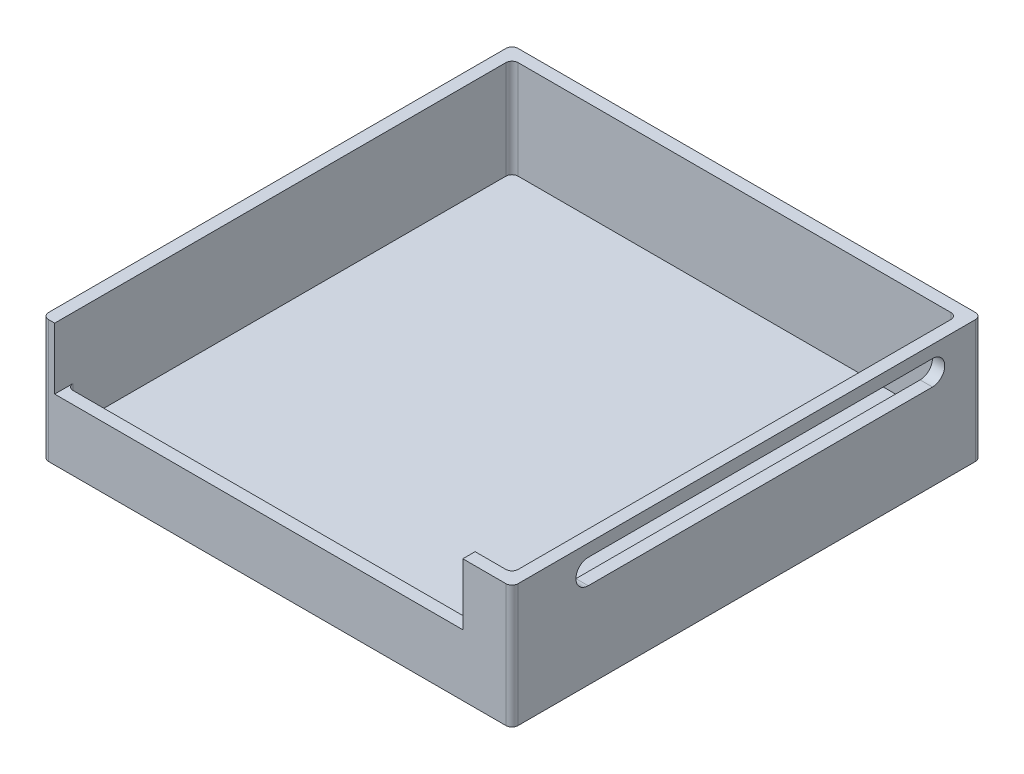
ISO-10303-21;
HEADER;
FILE_DESCRIPTION(('STEP AP214'),'2;1');
FILE_NAME('part.step','',(''),(''),'','','');
FILE_SCHEMA(('AUTOMOTIVE_DESIGN { 1 0 10303 214 1 1 1 1 }'));
ENDSEC;
DATA;
#1=APPLICATION_CONTEXT('core data for automotive mechanical design processes');
#2=APPLICATION_PROTOCOL_DEFINITION('international standard','automotive_design',2000,#1);
#3=PRODUCT_CONTEXT('',#1,'mechanical');
#4=PRODUCT('Part','Part','',(#3));
#5=PRODUCT_RELATED_PRODUCT_CATEGORY('part','',(#4));
#6=PRODUCT_DEFINITION_FORMATION('','',#4);
#7=PRODUCT_DEFINITION_CONTEXT('part definition',#1,'design');
#8=PRODUCT_DEFINITION('design','',#6,#7);
#9=PRODUCT_DEFINITION_SHAPE('','',#8);
#10=(LENGTH_UNIT() NAMED_UNIT(*) SI_UNIT(.MILLI.,.METRE.));
#11=(NAMED_UNIT(*) PLANE_ANGLE_UNIT() SI_UNIT($,.RADIAN.));
#12=(NAMED_UNIT(*) SI_UNIT($,.STERADIAN.) SOLID_ANGLE_UNIT());
#13=UNCERTAINTY_MEASURE_WITH_UNIT(LENGTH_MEASURE(1.E-05),#10,'distance_accuracy_value','');
#14=(GEOMETRIC_REPRESENTATION_CONTEXT(3) GLOBAL_UNCERTAINTY_ASSIGNED_CONTEXT((#13)) GLOBAL_UNIT_ASSIGNED_CONTEXT((#10,
#11,#12)) REPRESENTATION_CONTEXT('',''));
#15=CARTESIAN_POINT('',(0.,0.,0.));
#16=DIRECTION('',(0.,0.,1.));
#17=DIRECTION('',(1.,0.,0.));
#18=AXIS2_PLACEMENT_3D('',#15,#16,#17);
#19=CARTESIAN_POINT('',(-93.,50.,-93.));
#20=DIRECTION('',(0.,-1.,0.));
#21=DIRECTION('',(0.,0.,-1.));
#22=AXIS2_PLACEMENT_3D('',#19,#20,#21);
#23=PLANE('',#22);
#24=DIRECTION('',(1.,0.,0.));
#25=VECTOR('',#24,1.);
#26=CARTESIAN_POINT('',(-93.,50.,95.5));
#27=LINE('',#26,#25);
#28=CARTESIAN_POINT('',(-93.,50.,95.5));
#29=VERTEX_POINT('',#28);
#30=CARTESIAN_POINT('',(-90.5,50.,95.5));
#31=VERTEX_POINT('',#30);
#32=EDGE_CURVE('E350',#29,#31,#27,.T.);
#33=ORIENTED_EDGE('',*,*,#32,.T.);
#34=DIRECTION('',(0.,0.,1.));
#35=VECTOR('',#34,1.);
#36=CARTESIAN_POINT('',(-90.5,50.,-88.));
#37=LINE('',#36,#35);
#38=CARTESIAN_POINT('',(-90.5,50.,-88.));
#39=VERTEX_POINT('',#38);
#40=EDGE_CURVE('E295',#39,#31,#37,.T.);
#41=ORIENTED_EDGE('',*,*,#40,.F.);
#42=CARTESIAN_POINT('',(-88.,50.,-88.));
#43=DIRECTION('',(0.,1.,0.));
#44=DIRECTION('',(0.,0.,1.));
#45=AXIS2_PLACEMENT_3D('',#42,#43,#44);
#46=CIRCLE('',#45,2.5);
#47=CARTESIAN_POINT('',(-88.,50.,-90.5));
#48=VERTEX_POINT('',#47);
#49=EDGE_CURVE('E292',#48,#39,#46,.T.);
#50=ORIENTED_EDGE('',*,*,#49,.F.);
#51=DIRECTION('',(-1.,0.,0.));
#52=VECTOR('',#51,1.);
#53=CARTESIAN_POINT('',(-88.,50.,-90.5));
#54=LINE('',#53,#52);
#55=CARTESIAN_POINT('',(88.,50.,-90.5));
#56=VERTEX_POINT('',#55);
#57=EDGE_CURVE('E289',#56,#48,#54,.T.);
#58=ORIENTED_EDGE('',*,*,#57,.F.);
#59=CARTESIAN_POINT('',(88.,50.,-88.));
#60=DIRECTION('',(0.,1.,0.));
#61=DIRECTION('',(0.,0.,1.));
#62=AXIS2_PLACEMENT_3D('',#59,#60,#61);
#63=CIRCLE('',#62,2.5);
#64=CARTESIAN_POINT('',(90.5,50.,-88.));
#65=VERTEX_POINT('',#64);
#66=EDGE_CURVE('E286',#65,#56,#63,.T.);
#67=ORIENTED_EDGE('',*,*,#66,.F.);
#68=DIRECTION('',(0.,0.,-1.));
#69=VECTOR('',#68,1.);
#70=CARTESIAN_POINT('',(90.5,50.,-88.));
#71=LINE('',#70,#69);
#72=CARTESIAN_POINT('',(90.5000000000001,50.,88.));
#73=VERTEX_POINT('',#72);
#74=EDGE_CURVE('E305',#73,#65,#71,.T.);
#75=ORIENTED_EDGE('',*,*,#74,.F.);
#76=CARTESIAN_POINT('',(88.0000000000001,50.,88.));
#77=DIRECTION('',(0.,1.,0.));
#78=DIRECTION('',(0.,0.,1.));
#79=AXIS2_PLACEMENT_3D('',#76,#77,#78);
#80=CIRCLE('',#79,2.5);
#81=CARTESIAN_POINT('',(88.,50.,90.5));
#82=VERTEX_POINT('',#81);
#83=EDGE_CURVE('E301',#82,#73,#80,.T.);
#84=ORIENTED_EDGE('',*,*,#83,.F.);
#85=DIRECTION('',(1.,0.,0.));
#86=VECTOR('',#85,1.);
#87=CARTESIAN_POINT('',(-88.,50.,90.5));
#88=LINE('',#87,#86);
#89=CARTESIAN_POINT('',(75.5,50.,90.5));
#90=VERTEX_POINT('',#89);
#91=EDGE_CURVE('E298',#90,#82,#88,.T.);
#92=ORIENTED_EDGE('',*,*,#91,.F.);
#93=DIRECTION('',(0.,0.,1.));
#94=VECTOR('',#93,1.);
#95=CARTESIAN_POINT('',(75.5,50.,85.5));
#96=LINE('',#95,#94);
#97=CARTESIAN_POINT('',(75.5,50.,95.5));
#98=VERTEX_POINT('',#97);
#99=EDGE_CURVE('E245',#90,#98,#96,.T.);
#100=ORIENTED_EDGE('',*,*,#99,.T.);
#101=CARTESIAN_POINT('',(93.,50.,95.5));
#102=VERTEX_POINT('',#101);
#103=EDGE_CURVE('E349',#98,#102,#27,.T.);
#104=ORIENTED_EDGE('',*,*,#103,.T.);
#105=CARTESIAN_POINT('',(93.,50.,93.));
#106=DIRECTION('',(0.,1.,0.));
#107=DIRECTION('',(0.,0.,1.));
#108=AXIS2_PLACEMENT_3D('',#105,#106,#107);
#109=CIRCLE('',#108,2.5);
#110=CARTESIAN_POINT('',(95.5,50.,93.));
#111=VERTEX_POINT('',#110);
#112=EDGE_CURVE('E354',#102,#111,#109,.T.);
#113=ORIENTED_EDGE('',*,*,#112,.T.);
#114=DIRECTION('',(0.,0.,-1.));
#115=VECTOR('',#114,1.);
#116=CARTESIAN_POINT('',(95.5,50.,-93.));
#117=LINE('',#116,#115);
#118=CARTESIAN_POINT('',(95.5,50.,-93.));
#119=VERTEX_POINT('',#118);
#120=EDGE_CURVE('E357',#111,#119,#117,.T.);
#121=ORIENTED_EDGE('',*,*,#120,.T.);
#122=CARTESIAN_POINT('',(93.,50.,-93.));
#123=DIRECTION('',(0.,1.,0.));
#124=DIRECTION('',(0.,0.,1.));
#125=AXIS2_PLACEMENT_3D('',#122,#123,#124);
#126=CIRCLE('',#125,2.5);
#127=CARTESIAN_POINT('',(93.,50.,-95.5));
#128=VERTEX_POINT('',#127);
#129=EDGE_CURVE('E360',#119,#128,#126,.T.);
#130=ORIENTED_EDGE('',*,*,#129,.T.);
#131=DIRECTION('',(-1.,0.,0.));
#132=VECTOR('',#131,1.);
#133=CARTESIAN_POINT('',(-93.,50.,-95.5));
#134=LINE('',#133,#132);
#135=CARTESIAN_POINT('',(-93.,50.,-95.5));
#136=VERTEX_POINT('',#135);
#137=EDGE_CURVE('E363',#128,#136,#134,.T.);
#138=ORIENTED_EDGE('',*,*,#137,.T.);
#139=CARTESIAN_POINT('',(-93.,50.,-93.));
#140=DIRECTION('',(0.,1.,0.));
#141=DIRECTION('',(0.,0.,-1.));
#142=AXIS2_PLACEMENT_3D('',#139,#140,#141);
#143=CIRCLE('',#142,2.5);
#144=CARTESIAN_POINT('',(-95.5,50.,-93.));
#145=VERTEX_POINT('',#144);
#146=EDGE_CURVE('E338',#136,#145,#143,.T.);
#147=ORIENTED_EDGE('',*,*,#146,.T.);
#148=DIRECTION('',(0.,0.,1.));
#149=VECTOR('',#148,1.);
#150=CARTESIAN_POINT('',(-95.5,50.,-93.));
#151=LINE('',#150,#149);
#152=CARTESIAN_POINT('',(-95.5,50.,93.));
#153=VERTEX_POINT('',#152);
#154=EDGE_CURVE('E342',#145,#153,#151,.T.);
#155=ORIENTED_EDGE('',*,*,#154,.T.);
#156=CARTESIAN_POINT('',(-93.,50.,93.));
#157=DIRECTION('',(0.,1.,0.));
#158=DIRECTION('',(0.,0.,-1.));
#159=AXIS2_PLACEMENT_3D('',#156,#157,#158);
#160=CIRCLE('',#159,2.5);
#161=EDGE_CURVE('E346',#153,#29,#160,.T.);
#162=ORIENTED_EDGE('',*,*,#161,.T.);
#163=EDGE_LOOP('',(#33,#41,#50,#58,#67,#75,#84,#92,#100,#104,#113,#121,#130,#138,#147,#155,#162));
#164=FACE_BOUND('',#163,.T.);
#165=ADVANCED_FACE('F39',(#164),#23,.F.);
#166=CARTESIAN_POINT('',(-93.,50.,95.5));
#167=DIRECTION('',(0.,0.,-1.));
#168=DIRECTION('',(-1.,0.,0.));
#169=AXIS2_PLACEMENT_3D('',#166,#167,#168);
#170=PLANE('',#169);
#171=DIRECTION('',(0.,1.,0.));
#172=VECTOR('',#171,1.);
#173=CARTESIAN_POINT('',(-90.5,0.,95.5));
#174=LINE('',#173,#172);
#175=CARTESIAN_POINT('',(-90.5,25.,95.5));
#176=VERTEX_POINT('',#175);
#177=EDGE_CURVE('E236',#176,#31,#174,.T.);
#178=ORIENTED_EDGE('',*,*,#177,.T.);
#179=ORIENTED_EDGE('',*,*,#32,.F.);
#180=DIRECTION('',(0.,-1.,0.));
#181=VECTOR('',#180,1.);
#182=CARTESIAN_POINT('',(-93.,50.,95.5));
#183=LINE('',#182,#181);
#184=CARTESIAN_POINT('',(-93.,0.,95.5));
#185=VERTEX_POINT('',#184);
#186=EDGE_CURVE('E409',#29,#185,#183,.T.);
#187=ORIENTED_EDGE('',*,*,#186,.T.);
#188=DIRECTION('',(1.,0.,0.));
#189=VECTOR('',#188,1.);
#190=CARTESIAN_POINT('',(-93.,0.,95.5));
#191=LINE('',#190,#189);
#192=CARTESIAN_POINT('',(93.,0.,95.5));
#193=VERTEX_POINT('',#192);
#194=EDGE_CURVE('E376',#185,#193,#191,.T.);
#195=ORIENTED_EDGE('',*,*,#194,.T.);
#196=DIRECTION('',(0.,-1.,0.));
#197=VECTOR('',#196,1.);
#198=CARTESIAN_POINT('',(93.,50.,95.5));
#199=LINE('',#198,#197);
#200=EDGE_CURVE('E405',#102,#193,#199,.T.);
#201=ORIENTED_EDGE('',*,*,#200,.F.);
#202=ORIENTED_EDGE('',*,*,#103,.F.);
#203=DIRECTION('',(0.,1.,0.));
#204=VECTOR('',#203,1.);
#205=CARTESIAN_POINT('',(75.5,0.,95.5));
#206=LINE('',#205,#204);
#207=CARTESIAN_POINT('',(75.5,25.,95.5));
#208=VERTEX_POINT('',#207);
#209=EDGE_CURVE('E233',#208,#98,#206,.T.);
#210=ORIENTED_EDGE('',*,*,#209,.F.);
#211=DIRECTION('',(-1.,0.,0.));
#212=VECTOR('',#211,1.);
#213=CARTESIAN_POINT('',(0.,25.,95.5));
#214=LINE('',#213,#212);
#215=EDGE_CURVE('E225',#208,#176,#214,.T.);
#216=ORIENTED_EDGE('',*,*,#215,.T.);
#217=EDGE_LOOP('',(#178,#179,#187,#195,#201,#202,#210,#216));
#218=FACE_BOUND('',#217,.T.);
#219=ADVANCED_FACE('F456',(#218),#170,.F.);
#220=CARTESIAN_POINT('',(-88.,50.,88.));
#221=DIRECTION('',(0.,-1.,0.));
#222=DIRECTION('',(0.,0.,-1.));
#223=AXIS2_PLACEMENT_3D('',#220,#221,#222);
#224=CYLINDRICAL_SURFACE('',#223,2.5);
#225=DIRECTION('',(0.,-1.,0.));
#226=VECTOR('',#225,1.);
#227=CARTESIAN_POINT('',(-90.5,50.,88.));
#228=LINE('',#227,#226);
#229=CARTESIAN_POINT('',(-90.5,25.,88.));
#230=VERTEX_POINT('',#229);
#231=CARTESIAN_POINT('',(-90.5,10.,88.));
#232=VERTEX_POINT('',#231);
#233=EDGE_CURVE('E322',#230,#232,#228,.T.);
#234=ORIENTED_EDGE('',*,*,#233,.F.);
#235=CARTESIAN_POINT('',(-88.,25.,88.));
#236=DIRECTION('',(0.,1.,0.));
#237=DIRECTION('',(-1.,0.,0.));
#238=AXIS2_PLACEMENT_3D('',#235,#236,#237);
#239=CIRCLE('',#238,2.5);
#240=CARTESIAN_POINT('',(-88.,25.,90.5));
#241=VERTEX_POINT('',#240);
#242=EDGE_CURVE('E244',#230,#241,#239,.T.);
#243=ORIENTED_EDGE('',*,*,#242,.T.);
#244=DIRECTION('',(0.,-1.,0.));
#245=VECTOR('',#244,1.);
#246=CARTESIAN_POINT('',(-88.,50.,90.5));
#247=LINE('',#246,#245);
#248=CARTESIAN_POINT('',(-88.,10.,90.5));
#249=VERTEX_POINT('',#248);
#250=EDGE_CURVE('E319',#241,#249,#247,.T.);
#251=ORIENTED_EDGE('',*,*,#250,.T.);
#252=CARTESIAN_POINT('',(-88.,10.,88.));
#253=DIRECTION('',(0.,1.,0.));
#254=DIRECTION('',(0.,0.,1.));
#255=AXIS2_PLACEMENT_3D('',#252,#253,#254);
#256=CIRCLE('',#255,2.5);
#257=EDGE_CURVE('E262',#232,#249,#256,.T.);
#258=ORIENTED_EDGE('',*,*,#257,.F.);
#259=EDGE_LOOP('',(#234,#243,#251,#258));
#260=FACE_BOUND('',#259,.T.);
#261=ADVANCED_FACE('F462',(#260),#224,.F.);
#262=CARTESIAN_POINT('',(-88.,50.,90.5));
#263=DIRECTION('',(0.,0.,-1.));
#264=DIRECTION('',(-1.,0.,0.));
#265=AXIS2_PLACEMENT_3D('',#262,#263,#264);
#266=PLANE('',#265);
#267=ORIENTED_EDGE('',*,*,#250,.F.);
#268=DIRECTION('',(1.,0.,0.));
#269=VECTOR('',#268,1.);
#270=CARTESIAN_POINT('',(-88.,25.,90.5));
#271=LINE('',#270,#269);
#272=CARTESIAN_POINT('',(75.5,25.,90.5));
#273=VERTEX_POINT('',#272);
#274=EDGE_CURVE('E424',#241,#273,#271,.T.);
#275=ORIENTED_EDGE('',*,*,#274,.T.);
#276=DIRECTION('',(0.,-1.,0.));
#277=VECTOR('',#276,1.);
#278=CARTESIAN_POINT('',(75.5,50.,90.5));
#279=LINE('',#278,#277);
#280=EDGE_CURVE('E421',#90,#273,#279,.T.);
#281=ORIENTED_EDGE('',*,*,#280,.F.);
#282=ORIENTED_EDGE('',*,*,#91,.T.);
#283=DIRECTION('',(0.,-1.,0.));
#284=VECTOR('',#283,1.);
#285=CARTESIAN_POINT('',(88.,50.,90.5));
#286=LINE('',#285,#284);
#287=CARTESIAN_POINT('',(88.,10.,90.5));
#288=VERTEX_POINT('',#287);
#289=EDGE_CURVE('E315',#82,#288,#286,.T.);
#290=ORIENTED_EDGE('',*,*,#289,.T.);
#291=DIRECTION('',(1.,0.,0.));
#292=VECTOR('',#291,1.);
#293=CARTESIAN_POINT('',(-88.,10.,90.5));
#294=LINE('',#293,#292);
#295=EDGE_CURVE('E266',#249,#288,#294,.T.);
#296=ORIENTED_EDGE('',*,*,#295,.F.);
#297=EDGE_LOOP('',(#267,#275,#281,#282,#290,#296));
#298=FACE_BOUND('',#297,.T.);
#299=ADVANCED_FACE('F472',(#298),#266,.T.);
#300=CARTESIAN_POINT('',(-93.,0.,-93.));
#301=DIRECTION('',(0.,-1.,0.));
#302=DIRECTION('',(0.,0.,-1.));
#303=AXIS2_PLACEMENT_3D('',#300,#301,#302);
#304=PLANE('',#303);
#305=CARTESIAN_POINT('',(-93.,0.,-93.));
#306=DIRECTION('',(0.,1.,0.));
#307=DIRECTION('',(0.,0.,-1.));
#308=AXIS2_PLACEMENT_3D('',#305,#306,#307);
#309=CIRCLE('',#308,2.5);
#310=CARTESIAN_POINT('',(-93.,0.,-95.5));
#311=VERTEX_POINT('',#310);
#312=CARTESIAN_POINT('',(-95.5,0.,-93.));
#313=VERTEX_POINT('',#312);
#314=EDGE_CURVE('E337',#311,#313,#309,.T.);
#315=ORIENTED_EDGE('',*,*,#314,.F.);
#316=DIRECTION('',(-1.,0.,0.));
#317=VECTOR('',#316,1.);
#318=CARTESIAN_POINT('',(-93.,0.,-95.5));
#319=LINE('',#318,#317);
#320=CARTESIAN_POINT('',(93.,0.,-95.5));
#321=VERTEX_POINT('',#320);
#322=EDGE_CURVE('E343',#321,#311,#319,.T.);
#323=ORIENTED_EDGE('',*,*,#322,.F.);
#324=CARTESIAN_POINT('',(93.,0.,-93.));
#325=DIRECTION('',(0.,1.,0.));
#326=DIRECTION('',(0.,0.,1.));
#327=AXIS2_PLACEMENT_3D('',#324,#325,#326);
#328=CIRCLE('',#327,2.5);
#329=CARTESIAN_POINT('',(95.5,0.,-93.));
#330=VERTEX_POINT('',#329);
#331=EDGE_CURVE('E385',#330,#321,#328,.T.);
#332=ORIENTED_EDGE('',*,*,#331,.F.);
#333=DIRECTION('',(0.,0.,-1.));
#334=VECTOR('',#333,1.);
#335=CARTESIAN_POINT('',(95.5,0.,-93.));
#336=LINE('',#335,#334);
#337=CARTESIAN_POINT('',(95.5,0.,93.));
#338=VERTEX_POINT('',#337);
#339=EDGE_CURVE('E382',#338,#330,#336,.T.);
#340=ORIENTED_EDGE('',*,*,#339,.F.);
#341=CARTESIAN_POINT('',(93.,0.,93.));
#342=DIRECTION('',(0.,1.,0.));
#343=DIRECTION('',(0.,0.,1.));
#344=AXIS2_PLACEMENT_3D('',#341,#342,#343);
#345=CIRCLE('',#344,2.5);
#346=EDGE_CURVE('E379',#193,#338,#345,.T.);
#347=ORIENTED_EDGE('',*,*,#346,.F.);
#348=ORIENTED_EDGE('',*,*,#194,.F.);
#349=CARTESIAN_POINT('',(-93.,0.,93.));
#350=DIRECTION('',(0.,1.,0.));
#351=DIRECTION('',(0.,0.,-1.));
#352=AXIS2_PLACEMENT_3D('',#349,#350,#351);
#353=CIRCLE('',#352,2.5);
#354=CARTESIAN_POINT('',(-95.5,0.,93.));
#355=VERTEX_POINT('',#354);
#356=EDGE_CURVE('E373',#355,#185,#353,.T.);
#357=ORIENTED_EDGE('',*,*,#356,.F.);
#358=DIRECTION('',(0.,0.,1.));
#359=VECTOR('',#358,1.);
#360=CARTESIAN_POINT('',(-95.5,0.,-93.));
#361=LINE('',#360,#359);
#362=EDGE_CURVE('E370',#313,#355,#361,.T.);
#363=ORIENTED_EDGE('',*,*,#362,.F.);
#364=EDGE_LOOP('',(#315,#323,#332,#340,#347,#348,#357,#363));
#365=FACE_BOUND('',#364,.T.);
#366=ADVANCED_FACE('F469',(#365),#304,.T.);
#367=CARTESIAN_POINT('',(-93.,50.,-93.));
#368=DIRECTION('',(0.,-1.,0.));
#369=DIRECTION('',(0.,0.,-1.));
#370=AXIS2_PLACEMENT_3D('',#367,#368,#369);
#371=CYLINDRICAL_SURFACE('',#370,2.5);
#372=ORIENTED_EDGE('',*,*,#314,.T.);
#373=DIRECTION('',(0.,-1.,0.));
#374=VECTOR('',#373,1.);
#375=CARTESIAN_POINT('',(-95.5,50.,-93.));
#376=LINE('',#375,#374);
#377=EDGE_CURVE('E417',#145,#313,#376,.T.);
#378=ORIENTED_EDGE('',*,*,#377,.F.);
#379=ORIENTED_EDGE('',*,*,#146,.F.);
#380=DIRECTION('',(0.,-1.,0.));
#381=VECTOR('',#380,1.);
#382=CARTESIAN_POINT('',(-93.,50.,-95.5));
#383=LINE('',#382,#381);
#384=EDGE_CURVE('E366',#136,#311,#383,.T.);
#385=ORIENTED_EDGE('',*,*,#384,.T.);
#386=EDGE_LOOP('',(#372,#378,#379,#385));
#387=FACE_BOUND('',#386,.T.);
#388=ADVANCED_FACE('F41',(#387),#371,.T.);
#389=CARTESIAN_POINT('',(-95.5,50.,-93.));
#390=DIRECTION('',(1.,0.,0.));
#391=DIRECTION('',(0.,0.,-1.));
#392=AXIS2_PLACEMENT_3D('',#389,#390,#391);
#393=PLANE('',#392);
#394=ORIENTED_EDGE('',*,*,#362,.T.);
#395=DIRECTION('',(0.,-1.,0.));
#396=VECTOR('',#395,1.);
#397=CARTESIAN_POINT('',(-95.5,50.,93.));
#398=LINE('',#397,#396);
#399=EDGE_CURVE('E413',#153,#355,#398,.T.);
#400=ORIENTED_EDGE('',*,*,#399,.F.);
#401=ORIENTED_EDGE('',*,*,#154,.F.);
#402=ORIENTED_EDGE('',*,*,#377,.T.);
#403=EDGE_LOOP('',(#394,#400,#401,#402));
#404=FACE_BOUND('',#403,.T.);
#405=ADVANCED_FACE('F490',(#404),#393,.F.);
#406=CARTESIAN_POINT('',(-93.,50.,93.));
#407=DIRECTION('',(0.,-1.,0.));
#408=DIRECTION('',(0.,0.,-1.));
#409=AXIS2_PLACEMENT_3D('',#406,#407,#408);
#410=CYLINDRICAL_SURFACE('',#409,2.5);
#411=ORIENTED_EDGE('',*,*,#356,.T.);
#412=ORIENTED_EDGE('',*,*,#186,.F.);
#413=ORIENTED_EDGE('',*,*,#161,.F.);
#414=ORIENTED_EDGE('',*,*,#399,.T.);
#415=EDGE_LOOP('',(#411,#412,#413,#414));
#416=FACE_BOUND('',#415,.T.);
#417=ADVANCED_FACE('F486',(#416),#410,.T.);
#418=CARTESIAN_POINT('',(93.,50.,93.));
#419=DIRECTION('',(0.,-1.,0.));
#420=DIRECTION('',(0.,0.,-1.));
#421=AXIS2_PLACEMENT_3D('',#418,#419,#420);
#422=CYLINDRICAL_SURFACE('',#421,2.5);
#423=ORIENTED_EDGE('',*,*,#346,.T.);
#424=DIRECTION('',(0.,-1.,0.));
#425=VECTOR('',#424,1.);
#426=CARTESIAN_POINT('',(95.5,50.,93.));
#427=LINE('',#426,#425);
#428=EDGE_CURVE('E401',#111,#338,#427,.T.);
#429=ORIENTED_EDGE('',*,*,#428,.F.);
#430=ORIENTED_EDGE('',*,*,#112,.F.);
#431=ORIENTED_EDGE('',*,*,#200,.T.);
#432=EDGE_LOOP('',(#423,#429,#430,#431));
#433=FACE_BOUND('',#432,.T.);
#434=ADVANCED_FACE('F484',(#433),#422,.T.);
#435=CARTESIAN_POINT('',(95.5,50.,-93.));
#436=DIRECTION('',(-1.,0.,0.));
#437=DIRECTION('',(0.,0.,1.));
#438=AXIS2_PLACEMENT_3D('',#435,#436,#437);
#439=PLANE('',#438);
#440=CARTESIAN_POINT('',(95.5,40.,-75.5));
#441=DIRECTION('',(1.,0.,0.));
#442=DIRECTION('',(0.,0.,-1.));
#443=AXIS2_PLACEMENT_3D('',#440,#441,#442);
#444=CIRCLE('',#443,5.);
#445=CARTESIAN_POINT('',(95.5,35.,-75.5));
#446=VERTEX_POINT('',#445);
#447=CARTESIAN_POINT('',(95.5,45.,-75.5));
#448=VERTEX_POINT('',#447);
#449=EDGE_CURVE('E207',#446,#448,#444,.T.);
#450=ORIENTED_EDGE('',*,*,#449,.F.);
#451=DIRECTION('',(0.,0.,-1.));
#452=VECTOR('',#451,1.);
#453=CARTESIAN_POINT('',(95.5,35.,0.));
#454=LINE('',#453,#452);
#455=CARTESIAN_POINT('',(95.5,35.,64.5));
#456=VERTEX_POINT('',#455);
#457=EDGE_CURVE('E55',#456,#446,#454,.T.);
#458=ORIENTED_EDGE('',*,*,#457,.F.);
#459=CARTESIAN_POINT('',(95.5,40.,64.5));
#460=DIRECTION('',(1.,0.,0.));
#461=DIRECTION('',(0.,0.,-1.));
#462=AXIS2_PLACEMENT_3D('',#459,#460,#461);
#463=CIRCLE('',#462,5.);
#464=CARTESIAN_POINT('',(95.5,45.,64.5));
#465=VERTEX_POINT('',#464);
#466=EDGE_CURVE('E215',#465,#456,#463,.T.);
#467=ORIENTED_EDGE('',*,*,#466,.F.);
#468=DIRECTION('',(0.,0.,1.));
#469=VECTOR('',#468,1.);
#470=CARTESIAN_POINT('',(95.5,45.,0.));
#471=LINE('',#470,#469);
#472=EDGE_CURVE('E197',#448,#465,#471,.T.);
#473=ORIENTED_EDGE('',*,*,#472,.F.);
#474=EDGE_LOOP('',(#450,#458,#467,#473));
#475=FACE_BOUND('',#474,.T.);
#476=ORIENTED_EDGE('',*,*,#339,.T.);
#477=DIRECTION('',(0.,-1.,0.));
#478=VECTOR('',#477,1.);
#479=CARTESIAN_POINT('',(95.5,50.,-93.));
#480=LINE('',#479,#478);
#481=EDGE_CURVE('E397',#119,#330,#480,.T.);
#482=ORIENTED_EDGE('',*,*,#481,.F.);
#483=ORIENTED_EDGE('',*,*,#120,.F.);
#484=ORIENTED_EDGE('',*,*,#428,.T.);
#485=EDGE_LOOP('',(#476,#482,#483,#484));
#486=FACE_BOUND('',#485,.T.);
#487=ADVANCED_FACE('F212',(#475,#486),#439,.F.);
#488=CARTESIAN_POINT('',(93.,50.,-93.));
#489=DIRECTION('',(0.,-1.,0.));
#490=DIRECTION('',(0.,0.,-1.));
#491=AXIS2_PLACEMENT_3D('',#488,#489,#490);
#492=CYLINDRICAL_SURFACE('',#491,2.5);
#493=ORIENTED_EDGE('',*,*,#331,.T.);
#494=DIRECTION('',(0.,-1.,0.));
#495=VECTOR('',#494,1.);
#496=CARTESIAN_POINT('',(93.,50.,-95.5));
#497=LINE('',#496,#495);
#498=EDGE_CURVE('E393',#128,#321,#497,.T.);
#499=ORIENTED_EDGE('',*,*,#498,.F.);
#500=ORIENTED_EDGE('',*,*,#129,.F.);
#501=ORIENTED_EDGE('',*,*,#481,.T.);
#502=EDGE_LOOP('',(#493,#499,#500,#501));
#503=FACE_BOUND('',#502,.T.);
#504=ADVANCED_FACE('F477',(#503),#492,.T.);
#505=CARTESIAN_POINT('',(-93.,50.,-95.5));
#506=DIRECTION('',(0.,0.,1.));
#507=DIRECTION('',(1.,0.,0.));
#508=AXIS2_PLACEMENT_3D('',#505,#506,#507);
#509=PLANE('',#508);
#510=ORIENTED_EDGE('',*,*,#322,.T.);
#511=ORIENTED_EDGE('',*,*,#384,.F.);
#512=ORIENTED_EDGE('',*,*,#137,.F.);
#513=ORIENTED_EDGE('',*,*,#498,.T.);
#514=EDGE_LOOP('',(#510,#511,#512,#513));
#515=FACE_BOUND('',#514,.T.);
#516=ADVANCED_FACE('F474',(#515),#509,.F.);
#517=CARTESIAN_POINT('',(88.,50.,-88.));
#518=DIRECTION('',(0.,-1.,0.));
#519=DIRECTION('',(0.,0.,-1.));
#520=AXIS2_PLACEMENT_3D('',#517,#518,#519);
#521=CYLINDRICAL_SURFACE('',#520,2.5);
#522=CARTESIAN_POINT('',(88.,10.,-88.));
#523=DIRECTION('',(0.,1.,0.));
#524=DIRECTION('',(0.,0.,1.));
#525=AXIS2_PLACEMENT_3D('',#522,#523,#524);
#526=CIRCLE('',#525,2.5);
#527=CARTESIAN_POINT('',(90.5,10.,-88.));
#528=VERTEX_POINT('',#527);
#529=CARTESIAN_POINT('',(88.,10.,-90.5));
#530=VERTEX_POINT('',#529);
#531=EDGE_CURVE('E278',#528,#530,#526,.T.);
#532=ORIENTED_EDGE('',*,*,#531,.F.);
#533=DIRECTION('',(0.,-1.,0.));
#534=VECTOR('',#533,1.);
#535=CARTESIAN_POINT('',(90.5,50.,-88.));
#536=LINE('',#535,#534);
#537=EDGE_CURVE('E308',#65,#528,#536,.T.);
#538=ORIENTED_EDGE('',*,*,#537,.F.);
#539=ORIENTED_EDGE('',*,*,#66,.T.);
#540=DIRECTION('',(0.,-1.,0.));
#541=VECTOR('',#540,1.);
#542=CARTESIAN_POINT('',(88.,50.,-90.5));
#543=LINE('',#542,#541);
#544=EDGE_CURVE('E333',#56,#530,#543,.T.);
#545=ORIENTED_EDGE('',*,*,#544,.T.);
#546=EDGE_LOOP('',(#532,#538,#539,#545));
#547=FACE_BOUND('',#546,.T.);
#548=ADVANCED_FACE('F467',(#547),#521,.F.);
#549=CARTESIAN_POINT('',(-88.,50.,-90.5));
#550=DIRECTION('',(0.,0.,1.));
#551=DIRECTION('',(1.,0.,0.));
#552=AXIS2_PLACEMENT_3D('',#549,#550,#551);
#553=PLANE('',#552);
#554=DIRECTION('',(-1.,0.,0.));
#555=VECTOR('',#554,1.);
#556=CARTESIAN_POINT('',(-88.,10.,-90.5));
#557=LINE('',#556,#555);
#558=CARTESIAN_POINT('',(-88.,10.,-90.5));
#559=VERTEX_POINT('',#558);
#560=EDGE_CURVE('E282',#530,#559,#557,.T.);
#561=ORIENTED_EDGE('',*,*,#560,.F.);
#562=ORIENTED_EDGE('',*,*,#544,.F.);
#563=ORIENTED_EDGE('',*,*,#57,.T.);
#564=DIRECTION('',(0.,-1.,0.));
#565=VECTOR('',#564,1.);
#566=CARTESIAN_POINT('',(-88.,50.,-90.5));
#567=LINE('',#566,#565);
#568=EDGE_CURVE('E329',#48,#559,#567,.T.);
#569=ORIENTED_EDGE('',*,*,#568,.T.);
#570=EDGE_LOOP('',(#561,#562,#563,#569));
#571=FACE_BOUND('',#570,.T.);
#572=ADVANCED_FACE('F545',(#571),#553,.T.);
#573=CARTESIAN_POINT('',(-88.,50.,-88.));
#574=DIRECTION('',(0.,-1.,0.));
#575=DIRECTION('',(0.,0.,-1.));
#576=AXIS2_PLACEMENT_3D('',#573,#574,#575);
#577=CYLINDRICAL_SURFACE('',#576,2.5);
#578=CARTESIAN_POINT('',(-88.,10.,-88.));
#579=DIRECTION('',(0.,1.,0.));
#580=DIRECTION('',(0.,0.,1.));
#581=AXIS2_PLACEMENT_3D('',#578,#579,#580);
#582=CIRCLE('',#581,2.5);
#583=CARTESIAN_POINT('',(-90.5,10.,-88.));
#584=VERTEX_POINT('',#583);
#585=EDGE_CURVE('E254',#559,#584,#582,.T.);
#586=ORIENTED_EDGE('',*,*,#585,.F.);
#587=ORIENTED_EDGE('',*,*,#568,.F.);
#588=ORIENTED_EDGE('',*,*,#49,.T.);
#589=DIRECTION('',(0.,-1.,0.));
#590=VECTOR('',#589,1.);
#591=CARTESIAN_POINT('',(-90.5,50.,-88.));
#592=LINE('',#591,#590);
#593=EDGE_CURVE('E325',#39,#584,#592,.T.);
#594=ORIENTED_EDGE('',*,*,#593,.T.);
#595=EDGE_LOOP('',(#586,#587,#588,#594));
#596=FACE_BOUND('',#595,.T.);
#597=ADVANCED_FACE('F540',(#596),#577,.F.);
#598=CARTESIAN_POINT('',(-90.5,50.,-88.));
#599=DIRECTION('',(1.,0.,0.));
#600=DIRECTION('',(0.,0.,-1.));
#601=AXIS2_PLACEMENT_3D('',#598,#599,#600);
#602=PLANE('',#601);
#603=DIRECTION('',(0.,0.,1.));
#604=VECTOR('',#603,1.);
#605=CARTESIAN_POINT('',(-90.5,25.,85.5));
#606=LINE('',#605,#604);
#607=EDGE_CURVE('E241',#230,#176,#606,.T.);
#608=ORIENTED_EDGE('',*,*,#607,.F.);
#609=ORIENTED_EDGE('',*,*,#233,.T.);
#610=DIRECTION('',(0.,0.,1.));
#611=VECTOR('',#610,1.);
#612=CARTESIAN_POINT('',(-90.5,10.,-88.));
#613=LINE('',#612,#611);
#614=EDGE_CURVE('E258',#584,#232,#613,.T.);
#615=ORIENTED_EDGE('',*,*,#614,.F.);
#616=ORIENTED_EDGE('',*,*,#593,.F.);
#617=ORIENTED_EDGE('',*,*,#40,.T.);
#618=ORIENTED_EDGE('',*,*,#177,.F.);
#619=EDGE_LOOP('',(#608,#609,#615,#616,#617,#618));
#620=FACE_BOUND('',#619,.T.);
#621=ADVANCED_FACE('F525',(#620),#602,.T.);
#622=CARTESIAN_POINT('',(88.0000000000001,50.,88.));
#623=DIRECTION('',(0.,-1.,0.));
#624=DIRECTION('',(0.,0.,-1.));
#625=AXIS2_PLACEMENT_3D('',#622,#623,#624);
#626=CYLINDRICAL_SURFACE('',#625,2.5);
#627=CARTESIAN_POINT('',(88.,10.,88.));
#628=DIRECTION('',(0.,1.,0.));
#629=DIRECTION('',(0.,0.,1.));
#630=AXIS2_PLACEMENT_3D('',#627,#628,#629);
#631=CIRCLE('',#630,2.5);
#632=CARTESIAN_POINT('',(90.5000000000001,10.,88.));
#633=VERTEX_POINT('',#632);
#634=EDGE_CURVE('E270',#288,#633,#631,.T.);
#635=ORIENTED_EDGE('',*,*,#634,.F.);
#636=ORIENTED_EDGE('',*,*,#289,.F.);
#637=ORIENTED_EDGE('',*,*,#83,.T.);
#638=DIRECTION('',(0.,-1.,0.));
#639=VECTOR('',#638,1.);
#640=CARTESIAN_POINT('',(90.5000000000001,50.,88.));
#641=LINE('',#640,#639);
#642=EDGE_CURVE('E311',#73,#633,#641,.T.);
#643=ORIENTED_EDGE('',*,*,#642,.T.);
#644=EDGE_LOOP('',(#635,#636,#637,#643));
#645=FACE_BOUND('',#644,.T.);
#646=ADVANCED_FACE('F551',(#645),#626,.F.);
#647=CARTESIAN_POINT('',(90.5,50.,-88.));
#648=DIRECTION('',(-1.,0.,0.));
#649=DIRECTION('',(0.,0.,1.));
#650=AXIS2_PLACEMENT_3D('',#647,#648,#649);
#651=PLANE('',#650);
#652=DIRECTION('',(0.,0.,1.));
#653=VECTOR('',#652,1.);
#654=CARTESIAN_POINT('',(90.5,35.,-88.));
#655=LINE('',#654,#653);
#656=CARTESIAN_POINT('',(90.5,35.,-75.5));
#657=VERTEX_POINT('',#656);
#658=CARTESIAN_POINT('',(90.5000000000001,35.,64.5));
#659=VERTEX_POINT('',#658);
#660=EDGE_CURVE('E11',#657,#659,#655,.T.);
#661=ORIENTED_EDGE('',*,*,#660,.F.);
#662=CARTESIAN_POINT('',(90.5,40.,-75.5));
#663=DIRECTION('',(-1.,0.,0.));
#664=DIRECTION('',(0.,0.,1.));
#665=AXIS2_PLACEMENT_3D('',#662,#663,#664);
#666=CIRCLE('',#665,5.);
#667=CARTESIAN_POINT('',(90.5,45.,-75.5));
#668=VERTEX_POINT('',#667);
#669=EDGE_CURVE('E428',#668,#657,#666,.T.);
#670=ORIENTED_EDGE('',*,*,#669,.F.);
#671=DIRECTION('',(0.,0.,-1.));
#672=VECTOR('',#671,1.);
#673=CARTESIAN_POINT('',(90.5,45.,-88.));
#674=LINE('',#673,#672);
#675=CARTESIAN_POINT('',(90.5,45.,64.5));
#676=VERTEX_POINT('',#675);
#677=EDGE_CURVE('E200',#676,#668,#674,.T.);
#678=ORIENTED_EDGE('',*,*,#677,.F.);
#679=CARTESIAN_POINT('',(90.5000000000001,40.,64.5));
#680=DIRECTION('',(-1.,0.,0.));
#681=DIRECTION('',(0.,0.,1.));
#682=AXIS2_PLACEMENT_3D('',#679,#680,#681);
#683=CIRCLE('',#682,5.);
#684=EDGE_CURVE('E48',#659,#676,#683,.T.);
#685=ORIENTED_EDGE('',*,*,#684,.F.);
#686=EDGE_LOOP('',(#661,#670,#678,#685));
#687=FACE_BOUND('',#686,.T.);
#688=DIRECTION('',(0.,0.,-1.));
#689=VECTOR('',#688,1.);
#690=CARTESIAN_POINT('',(90.5,10.,-88.));
#691=LINE('',#690,#689);
#692=EDGE_CURVE('E274',#633,#528,#691,.T.);
#693=ORIENTED_EDGE('',*,*,#692,.F.);
#694=ORIENTED_EDGE('',*,*,#642,.F.);
#695=ORIENTED_EDGE('',*,*,#74,.T.);
#696=ORIENTED_EDGE('',*,*,#537,.T.);
#697=EDGE_LOOP('',(#693,#694,#695,#696));
#698=FACE_BOUND('',#697,.T.);
#699=ADVANCED_FACE('F439',(#687,#698),#651,.T.);
#700=CARTESIAN_POINT('',(-88.,10.,-88.));
#701=DIRECTION('',(0.,1.,0.));
#702=DIRECTION('',(0.,0.,1.));
#703=AXIS2_PLACEMENT_3D('',#700,#701,#702);
#704=PLANE('',#703);
#705=ORIENTED_EDGE('',*,*,#585,.T.);
#706=ORIENTED_EDGE('',*,*,#614,.T.);
#707=ORIENTED_EDGE('',*,*,#257,.T.);
#708=ORIENTED_EDGE('',*,*,#295,.T.);
#709=ORIENTED_EDGE('',*,*,#634,.T.);
#710=ORIENTED_EDGE('',*,*,#692,.T.);
#711=ORIENTED_EDGE('',*,*,#531,.T.);
#712=ORIENTED_EDGE('',*,*,#560,.T.);
#713=EDGE_LOOP('',(#705,#706,#707,#708,#709,#710,#711,#712));
#714=FACE_BOUND('',#713,.T.);
#715=ADVANCED_FACE('F543',(#714),#704,.T.);
#716=CARTESIAN_POINT('',(0.,25.,85.5));
#717=DIRECTION('',(0.,1.,0.));
#718=DIRECTION('',(-1.,0.,0.));
#719=AXIS2_PLACEMENT_3D('',#716,#717,#718);
#720=PLANE('',#719);
#721=ORIENTED_EDGE('',*,*,#607,.T.);
#722=ORIENTED_EDGE('',*,*,#215,.F.);
#723=DIRECTION('',(0.,0.,1.));
#724=VECTOR('',#723,1.);
#725=CARTESIAN_POINT('',(75.5,25.,85.5));
#726=LINE('',#725,#724);
#727=EDGE_CURVE('E240',#273,#208,#726,.T.);
#728=ORIENTED_EDGE('',*,*,#727,.F.);
#729=ORIENTED_EDGE('',*,*,#274,.F.);
#730=ORIENTED_EDGE('',*,*,#242,.F.);
#731=EDGE_LOOP('',(#721,#722,#728,#729,#730));
#732=FACE_BOUND('',#731,.T.);
#733=ADVANCED_FACE('F451',(#732),#720,.T.);
#734=CARTESIAN_POINT('',(75.5,0.,85.5));
#735=DIRECTION('',(1.,0.,0.));
#736=DIRECTION('',(0.,0.,-1.));
#737=AXIS2_PLACEMENT_3D('',#734,#735,#736);
#738=PLANE('',#737);
#739=ORIENTED_EDGE('',*,*,#280,.T.);
#740=ORIENTED_EDGE('',*,*,#727,.T.);
#741=ORIENTED_EDGE('',*,*,#209,.T.);
#742=ORIENTED_EDGE('',*,*,#99,.F.);
#743=EDGE_LOOP('',(#739,#740,#741,#742));
#744=FACE_BOUND('',#743,.T.);
#745=ADVANCED_FACE('F444',(#744),#738,.F.);
#746=CARTESIAN_POINT('',(85.5,35.,0.));
#747=DIRECTION('',(0.,-1.,0.));
#748=DIRECTION('',(0.,0.,-1.));
#749=AXIS2_PLACEMENT_3D('',#746,#747,#748);
#750=PLANE('',#749);
#751=ORIENTED_EDGE('',*,*,#660,.T.);
#752=DIRECTION('',(1.,0.,0.));
#753=VECTOR('',#752,1.);
#754=CARTESIAN_POINT('',(85.5,35.,64.5));
#755=LINE('',#754,#753);
#756=EDGE_CURVE('E222',#659,#456,#755,.T.);
#757=ORIENTED_EDGE('',*,*,#756,.T.);
#758=ORIENTED_EDGE('',*,*,#457,.T.);
#759=DIRECTION('',(1.,0.,0.));
#760=VECTOR('',#759,1.);
#761=CARTESIAN_POINT('',(85.5,35.,-75.5));
#762=LINE('',#761,#760);
#763=EDGE_CURVE('E204',#657,#446,#762,.T.);
#764=ORIENTED_EDGE('',*,*,#763,.F.);
#765=EDGE_LOOP('',(#751,#757,#758,#764));
#766=FACE_BOUND('',#765,.T.);
#767=ADVANCED_FACE('F441',(#766),#750,.F.);
#768=CARTESIAN_POINT('',(85.5,40.,64.5));
#769=DIRECTION('',(1.,0.,0.));
#770=DIRECTION('',(0.,0.,-1.));
#771=AXIS2_PLACEMENT_3D('',#768,#769,#770);
#772=CYLINDRICAL_SURFACE('',#771,5.);
#773=ORIENTED_EDGE('',*,*,#684,.T.);
#774=DIRECTION('',(1.,0.,0.));
#775=VECTOR('',#774,1.);
#776=CARTESIAN_POINT('',(85.5,45.,64.5));
#777=LINE('',#776,#775);
#778=EDGE_CURVE('E203',#676,#465,#777,.T.);
#779=ORIENTED_EDGE('',*,*,#778,.T.);
#780=ORIENTED_EDGE('',*,*,#466,.T.);
#781=ORIENTED_EDGE('',*,*,#756,.F.);
#782=EDGE_LOOP('',(#773,#779,#780,#781));
#783=FACE_BOUND('',#782,.T.);
#784=ADVANCED_FACE('F436',(#783),#772,.F.);
#785=CARTESIAN_POINT('',(85.5,45.,0.));
#786=DIRECTION('',(0.,1.,0.));
#787=DIRECTION('',(0.,0.,1.));
#788=AXIS2_PLACEMENT_3D('',#785,#786,#787);
#789=PLANE('',#788);
#790=ORIENTED_EDGE('',*,*,#677,.T.);
#791=DIRECTION('',(1.,0.,0.));
#792=VECTOR('',#791,1.);
#793=CARTESIAN_POINT('',(85.5,45.,-75.5));
#794=LINE('',#793,#792);
#795=EDGE_CURVE('E63',#668,#448,#794,.T.);
#796=ORIENTED_EDGE('',*,*,#795,.T.);
#797=ORIENTED_EDGE('',*,*,#472,.T.);
#798=ORIENTED_EDGE('',*,*,#778,.F.);
#799=EDGE_LOOP('',(#790,#796,#797,#798));
#800=FACE_BOUND('',#799,.T.);
#801=ADVANCED_FACE('F194',(#800),#789,.F.);
#802=CARTESIAN_POINT('',(85.5,40.,-75.5));
#803=DIRECTION('',(1.,0.,0.));
#804=DIRECTION('',(0.,0.,-1.));
#805=AXIS2_PLACEMENT_3D('',#802,#803,#804);
#806=CYLINDRICAL_SURFACE('',#805,5.);
#807=ORIENTED_EDGE('',*,*,#669,.T.);
#808=ORIENTED_EDGE('',*,*,#763,.T.);
#809=ORIENTED_EDGE('',*,*,#449,.T.);
#810=ORIENTED_EDGE('',*,*,#795,.F.);
#811=EDGE_LOOP('',(#807,#808,#809,#810));
#812=FACE_BOUND('',#811,.T.);
#813=ADVANCED_FACE('F208',(#812),#806,.F.);
#814=CLOSED_SHELL('',(#165,#219,#261,#299,#366,#388,#405,#417,#434,#487,#504,#516,#548,#572,
#597,#621,#646,#699,#715,#733,#745,#767,#784,#801,#813));
#815=MANIFOLD_SOLID_BREP('B2',#814);
#816=ADVANCED_BREP_SHAPE_REPRESENTATION('',(#18,#815),#14);
#817=SHAPE_DEFINITION_REPRESENTATION(#9,#816);
ENDSEC;
END-ISO-10303-21;
